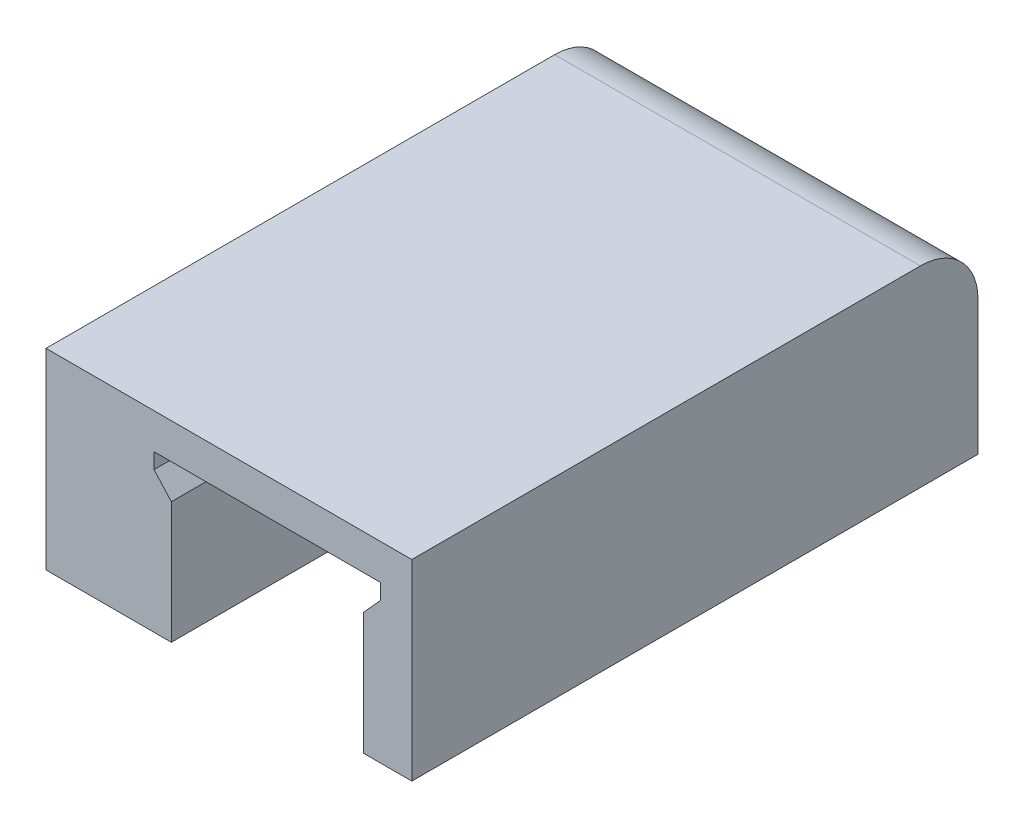
ISO-10303-21;
HEADER;
FILE_DESCRIPTION(('STEP AP214'),'2;1');
FILE_NAME('part.step','',(''),(''),'','','');
FILE_SCHEMA(('AUTOMOTIVE_DESIGN { 1 0 10303 214 1 1 1 1 }'));
ENDSEC;
DATA;
#1=APPLICATION_CONTEXT('core data for automotive mechanical design processes');
#2=APPLICATION_PROTOCOL_DEFINITION('international standard','automotive_design',2000,#1);
#3=PRODUCT_CONTEXT('',#1,'mechanical');
#4=PRODUCT('Part','Part','',(#3));
#5=PRODUCT_RELATED_PRODUCT_CATEGORY('part','',(#4));
#6=PRODUCT_DEFINITION_FORMATION('','',#4);
#7=PRODUCT_DEFINITION_CONTEXT('part definition',#1,'design');
#8=PRODUCT_DEFINITION('design','',#6,#7);
#9=PRODUCT_DEFINITION_SHAPE('','',#8);
#10=(LENGTH_UNIT() NAMED_UNIT(*) SI_UNIT(.MILLI.,.METRE.));
#11=(NAMED_UNIT(*) PLANE_ANGLE_UNIT() SI_UNIT($,.RADIAN.));
#12=(NAMED_UNIT(*) SI_UNIT($,.STERADIAN.) SOLID_ANGLE_UNIT());
#13=UNCERTAINTY_MEASURE_WITH_UNIT(LENGTH_MEASURE(1.E-05),#10,'distance_accuracy_value','');
#14=(GEOMETRIC_REPRESENTATION_CONTEXT(3) GLOBAL_UNCERTAINTY_ASSIGNED_CONTEXT((#13)) GLOBAL_UNIT_ASSIGNED_CONTEXT((#10,
#11,#12)) REPRESENTATION_CONTEXT('',''));
#15=CARTESIAN_POINT('',(0.,0.,0.));
#16=DIRECTION('',(0.,0.,1.));
#17=DIRECTION('',(1.,0.,0.));
#18=AXIS2_PLACEMENT_3D('',#15,#16,#17);
#19=CARTESIAN_POINT('',(13.06,5.,-14.75));
#20=DIRECTION('',(0.,0.,1.));
#21=DIRECTION('',(1.,0.,0.));
#22=AXIS2_PLACEMENT_3D('',#19,#20,#21);
#23=PLANE('',#22);
#24=DIRECTION('',(-1.,0.,0.));
#25=VECTOR('',#24,1.);
#26=CARTESIAN_POINT('',(13.06,-5.,-14.75));
#27=LINE('',#26,#25);
#28=CARTESIAN_POINT('',(14.06,-5.,-14.75));
#29=VERTEX_POINT('',#28);
#30=CARTESIAN_POINT('',(-5.,-5.,-14.75));
#31=VERTEX_POINT('',#30);
#32=EDGE_CURVE('E222',#29,#31,#27,.T.);
#33=ORIENTED_EDGE('',*,*,#32,.T.);
#34=DIRECTION('',(0.,1.,0.));
#35=VECTOR('',#34,1.);
#36=CARTESIAN_POINT('',(-5.,0.,-14.75));
#37=LINE('',#36,#35);
#38=CARTESIAN_POINT('',(-5.,2.,-14.75));
#39=VERTEX_POINT('',#38);
#40=EDGE_CURVE('E166',#31,#39,#37,.T.);
#41=ORIENTED_EDGE('',*,*,#40,.T.);
#42=DIRECTION('',(-1.,0.,0.));
#43=VECTOR('',#42,1.);
#44=CARTESIAN_POINT('',(13.06,2.,-14.75));
#45=LINE('',#44,#43);
#46=CARTESIAN_POINT('',(14.06,2.,-14.75));
#47=VERTEX_POINT('',#46);
#48=EDGE_CURVE('E238',#39,#47,#45,.F.);
#49=ORIENTED_EDGE('',*,*,#48,.T.);
#50=DIRECTION('',(0.,1.,0.));
#51=VECTOR('',#50,1.);
#52=CARTESIAN_POINT('',(14.06,-5.,-14.75));
#53=LINE('',#52,#51);
#54=EDGE_CURVE('E174',#29,#47,#53,.T.);
#55=ORIENTED_EDGE('',*,*,#54,.F.);
#56=EDGE_LOOP('',(#33,#41,#49,#55));
#57=FACE_BOUND('',#56,.T.);
#58=ADVANCED_FACE('F41',(#57),#23,.F.);
#59=CARTESIAN_POINT('',(13.06,5.,14.75));
#60=DIRECTION('',(0.,-1.,0.));
#61=DIRECTION('',(0.,0.,-1.));
#62=AXIS2_PLACEMENT_3D('',#59,#60,#61);
#63=PLANE('',#62);
#64=DIRECTION('',(-1.,0.,0.));
#65=VECTOR('',#64,1.);
#66=CARTESIAN_POINT('',(13.06,5.,14.75));
#67=LINE('',#66,#65);
#68=CARTESIAN_POINT('',(14.06,5.,14.75));
#69=VERTEX_POINT('',#68);
#70=CARTESIAN_POINT('',(-5.,5.,14.75));
#71=VERTEX_POINT('',#70);
#72=EDGE_CURVE('E136',#69,#71,#67,.T.);
#73=ORIENTED_EDGE('',*,*,#72,.F.);
#74=DIRECTION('',(0.,0.,1.));
#75=VECTOR('',#74,1.);
#76=CARTESIAN_POINT('',(14.06,5.,-11.75));
#77=LINE('',#76,#75);
#78=CARTESIAN_POINT('',(14.06,5.,-11.75));
#79=VERTEX_POINT('',#78);
#80=EDGE_CURVE('E180',#79,#69,#77,.T.);
#81=ORIENTED_EDGE('',*,*,#80,.F.);
#82=DIRECTION('',(-1.,0.,0.));
#83=VECTOR('',#82,1.);
#84=CARTESIAN_POINT('',(13.06,5.,-11.75));
#85=LINE('',#84,#83);
#86=CARTESIAN_POINT('',(-5.,5.,-11.75));
#87=VERTEX_POINT('',#86);
#88=EDGE_CURVE('E148',#79,#87,#85,.T.);
#89=ORIENTED_EDGE('',*,*,#88,.T.);
#90=DIRECTION('',(0.,0.,1.));
#91=VECTOR('',#90,1.);
#92=CARTESIAN_POINT('',(-5.,5.,0.));
#93=LINE('',#92,#91);
#94=EDGE_CURVE('E156',#87,#71,#93,.T.);
#95=ORIENTED_EDGE('',*,*,#94,.T.);
#96=EDGE_LOOP('',(#73,#81,#89,#95));
#97=FACE_BOUND('',#96,.T.);
#98=ADVANCED_FACE('F162',(#97),#63,.F.);
#99=CARTESIAN_POINT('',(13.06,5.,14.75));
#100=DIRECTION('',(0.,0.,-1.));
#101=DIRECTION('',(0.,1.,0.));
#102=AXIS2_PLACEMENT_3D('',#99,#100,#101);
#103=PLANE('',#102);
#104=DIRECTION('',(0.66896473162245,0.743294146247166,0.));
#105=VECTOR('',#104,1.);
#106=CARTESIAN_POINT('',(12.43,2.34243959921544,14.75));
#107=LINE('',#106,#105);
#108=CARTESIAN_POINT('',(11.53,1.34243959921544,14.75));
#109=VERTEX_POINT('',#108);
#110=CARTESIAN_POINT('',(12.43,2.34243959921544,14.75));
#111=VERTEX_POINT('',#110);
#112=EDGE_CURVE('E204',#109,#111,#107,.T.);
#113=ORIENTED_EDGE('',*,*,#112,.F.);
#114=DIRECTION('',(0.,1.,0.));
#115=VECTOR('',#114,1.);
#116=CARTESIAN_POINT('',(11.53,1.34243959921544,14.75));
#117=LINE('',#116,#115);
#118=CARTESIAN_POINT('',(11.53,-5.,14.75));
#119=VERTEX_POINT('',#118);
#120=EDGE_CURVE('E183',#119,#109,#117,.T.);
#121=ORIENTED_EDGE('',*,*,#120,.F.);
#122=DIRECTION('',(-1.,0.,0.));
#123=VECTOR('',#122,1.);
#124=CARTESIAN_POINT('',(13.06,-5.,14.75));
#125=LINE('',#124,#123);
#126=CARTESIAN_POINT('',(14.06,-5.,14.75));
#127=VERTEX_POINT('',#126);
#128=EDGE_CURVE('E149',#127,#119,#125,.T.);
#129=ORIENTED_EDGE('',*,*,#128,.F.);
#130=DIRECTION('',(0.,-1.,0.));
#131=VECTOR('',#130,1.);
#132=CARTESIAN_POINT('',(14.06,5.,14.75));
#133=LINE('',#132,#131);
#134=EDGE_CURVE('E143',#69,#127,#133,.T.);
#135=ORIENTED_EDGE('',*,*,#134,.F.);
#136=ORIENTED_EDGE('',*,*,#72,.T.);
#137=DIRECTION('',(0.,-1.,0.));
#138=VECTOR('',#137,1.);
#139=CARTESIAN_POINT('',(-5.,0.,14.75));
#140=LINE('',#139,#138);
#141=CARTESIAN_POINT('',(-5.,-5.,14.75));
#142=VERTEX_POINT('',#141);
#143=EDGE_CURVE('E141',#71,#142,#140,.T.);
#144=ORIENTED_EDGE('',*,*,#143,.T.);
#145=CARTESIAN_POINT('',(1.53,-5.,14.75));
#146=VERTEX_POINT('',#145);
#147=EDGE_CURVE('E234',#146,#142,#125,.T.);
#148=ORIENTED_EDGE('',*,*,#147,.F.);
#149=DIRECTION('',(0.,-1.,0.));
#150=VECTOR('',#149,1.);
#151=CARTESIAN_POINT('',(1.53,-7.00493567067932,14.75));
#152=LINE('',#151,#150);
#153=CARTESIAN_POINT('',(1.53,1.34243959921544,14.75));
#154=VERTEX_POINT('',#153);
#155=EDGE_CURVE('E187',#154,#146,#152,.T.);
#156=ORIENTED_EDGE('',*,*,#155,.F.);
#157=DIRECTION('',(0.66896473162245,-0.743294146247166,0.));
#158=VECTOR('',#157,1.);
#159=CARTESIAN_POINT('',(1.53,1.34243959921544,14.75));
#160=LINE('',#159,#158);
#161=CARTESIAN_POINT('',(0.63,2.34243959921544,14.75));
#162=VERTEX_POINT('',#161);
#163=EDGE_CURVE('E216',#162,#154,#160,.T.);
#164=ORIENTED_EDGE('',*,*,#163,.F.);
#165=DIRECTION('',(0.,-1.,0.));
#166=VECTOR('',#165,1.);
#167=CARTESIAN_POINT('',(0.63,2.34243959921544,14.75));
#168=LINE('',#167,#166);
#169=CARTESIAN_POINT('',(0.63,3.15,14.75));
#170=VERTEX_POINT('',#169);
#171=EDGE_CURVE('E213',#170,#162,#168,.T.);
#172=ORIENTED_EDGE('',*,*,#171,.F.);
#173=DIRECTION('',(-1.,0.,0.));
#174=VECTOR('',#173,1.);
#175=CARTESIAN_POINT('',(0.63,3.15,14.75));
#176=LINE('',#175,#174);
#177=CARTESIAN_POINT('',(12.43,3.15,14.75));
#178=VERTEX_POINT('',#177);
#179=EDGE_CURVE('E210',#178,#170,#176,.T.);
#180=ORIENTED_EDGE('',*,*,#179,.F.);
#181=DIRECTION('',(0.,1.,0.));
#182=VECTOR('',#181,1.);
#183=CARTESIAN_POINT('',(12.43,3.15,14.75));
#184=LINE('',#183,#182);
#185=EDGE_CURVE('E207',#111,#178,#184,.T.);
#186=ORIENTED_EDGE('',*,*,#185,.F.);
#187=EDGE_LOOP('',(#113,#121,#129,#135,#136,#144,#148,#156,#164,#172,#180,#186));
#188=FACE_BOUND('',#187,.T.);
#189=ADVANCED_FACE('F139',(#188),#103,.F.);
#190=CARTESIAN_POINT('',(13.06,-5.,14.75));
#191=DIRECTION('',(0.,1.,0.));
#192=DIRECTION('',(0.,0.,1.));
#193=AXIS2_PLACEMENT_3D('',#190,#191,#192);
#194=PLANE('',#193);
#195=ORIENTED_EDGE('',*,*,#128,.T.);
#196=DIRECTION('',(0.,0.,-1.));
#197=VECTOR('',#196,1.);
#198=CARTESIAN_POINT('',(11.53,-5.,14.75));
#199=LINE('',#198,#197);
#200=CARTESIAN_POINT('',(11.53,-5.,-10.6));
#201=VERTEX_POINT('',#200);
#202=EDGE_CURVE('E11',#119,#201,#199,.T.);
#203=ORIENTED_EDGE('',*,*,#202,.T.);
#204=DIRECTION('',(-1.,0.,0.));
#205=VECTOR('',#204,1.);
#206=CARTESIAN_POINT('',(13.06,-5.,-10.6));
#207=LINE('',#206,#205);
#208=CARTESIAN_POINT('',(1.53,-5.,-10.6));
#209=VERTEX_POINT('',#208);
#210=EDGE_CURVE('E61',#201,#209,#207,.T.);
#211=ORIENTED_EDGE('',*,*,#210,.T.);
#212=DIRECTION('',(0.,0.,1.));
#213=VECTOR('',#212,1.);
#214=CARTESIAN_POINT('',(1.53,-5.,14.75));
#215=LINE('',#214,#213);
#216=EDGE_CURVE('E49',#209,#146,#215,.T.);
#217=ORIENTED_EDGE('',*,*,#216,.T.);
#218=ORIENTED_EDGE('',*,*,#147,.T.);
#219=DIRECTION('',(0.,0.,-1.));
#220=VECTOR('',#219,1.);
#221=CARTESIAN_POINT('',(-5.,-5.,0.));
#222=LINE('',#221,#220);
#223=EDGE_CURVE('E160',#142,#31,#222,.T.);
#224=ORIENTED_EDGE('',*,*,#223,.T.);
#225=ORIENTED_EDGE('',*,*,#32,.F.);
#226=DIRECTION('',(0.,0.,-1.));
#227=VECTOR('',#226,1.);
#228=CARTESIAN_POINT('',(14.06,-5.,14.75));
#229=LINE('',#228,#227);
#230=EDGE_CURVE('E171',#127,#29,#229,.T.);
#231=ORIENTED_EDGE('',*,*,#230,.F.);
#232=EDGE_LOOP('',(#195,#203,#211,#217,#218,#224,#225,#231));
#233=FACE_BOUND('',#232,.T.);
#234=ADVANCED_FACE('F242',(#233),#194,.F.);
#235=CARTESIAN_POINT('',(13.06,2.,-11.75));
#236=DIRECTION('',(-1.,0.,0.));
#237=DIRECTION('',(0.,0.,1.));
#238=AXIS2_PLACEMENT_3D('',#235,#236,#237);
#239=CYLINDRICAL_SURFACE('',#238,3.);
#240=ORIENTED_EDGE('',*,*,#88,.F.);
#241=CARTESIAN_POINT('',(14.06,2.,-11.75));
#242=DIRECTION('',(1.,0.,0.));
#243=DIRECTION('',(0.,0.,-1.));
#244=AXIS2_PLACEMENT_3D('',#241,#242,#243);
#245=CIRCLE('',#244,3.);
#246=EDGE_CURVE('E177',#47,#79,#245,.T.);
#247=ORIENTED_EDGE('',*,*,#246,.F.);
#248=ORIENTED_EDGE('',*,*,#48,.F.);
#249=CARTESIAN_POINT('',(-5.,2.,-11.75));
#250=DIRECTION('',(1.,0.,0.));
#251=DIRECTION('',(0.,0.,-1.));
#252=AXIS2_PLACEMENT_3D('',#249,#250,#251);
#253=CIRCLE('',#252,3.);
#254=EDGE_CURVE('E169',#39,#87,#253,.T.);
#255=ORIENTED_EDGE('',*,*,#254,.T.);
#256=EDGE_LOOP('',(#240,#247,#248,#255));
#257=FACE_BOUND('',#256,.T.);
#258=ADVANCED_FACE('F43',(#257),#239,.T.);
#259=CARTESIAN_POINT('',(11.53,1.34243959921544,-10.6));
#260=DIRECTION('',(1.,0.,0.));
#261=DIRECTION('',(0.,1.,0.));
#262=AXIS2_PLACEMENT_3D('',#259,#260,#261);
#263=PLANE('',#262);
#264=ORIENTED_EDGE('',*,*,#120,.T.);
#265=DIRECTION('',(0.,0.,1.));
#266=VECTOR('',#265,1.);
#267=CARTESIAN_POINT('',(11.53,1.34243959921544,-10.6));
#268=LINE('',#267,#266);
#269=CARTESIAN_POINT('',(11.53,1.34243959921544,-10.6));
#270=VERTEX_POINT('',#269);
#271=EDGE_CURVE('E202',#270,#109,#268,.T.);
#272=ORIENTED_EDGE('',*,*,#271,.F.);
#273=DIRECTION('',(0.,1.,0.));
#274=VECTOR('',#273,1.);
#275=CARTESIAN_POINT('',(11.53,1.34243959921544,-10.6));
#276=LINE('',#275,#274);
#277=EDGE_CURVE('E184',#201,#270,#276,.T.);
#278=ORIENTED_EDGE('',*,*,#277,.F.);
#279=ORIENTED_EDGE('',*,*,#202,.F.);
#280=EDGE_LOOP('',(#264,#272,#278,#279));
#281=FACE_BOUND('',#280,.T.);
#282=ADVANCED_FACE('F286',(#281),#263,.F.);
#283=CARTESIAN_POINT('',(1.53,-7.00493567067932,-10.6));
#284=DIRECTION('',(-1.,0.,0.));
#285=DIRECTION('',(0.,0.,1.));
#286=AXIS2_PLACEMENT_3D('',#283,#284,#285);
#287=PLANE('',#286);
#288=DIRECTION('',(0.,-1.,0.));
#289=VECTOR('',#288,1.);
#290=CARTESIAN_POINT('',(1.53,-7.00493567067932,-10.6));
#291=LINE('',#290,#289);
#292=CARTESIAN_POINT('',(1.53,1.34243959921544,-10.6));
#293=VERTEX_POINT('',#292);
#294=EDGE_CURVE('E56',#293,#209,#291,.T.);
#295=ORIENTED_EDGE('',*,*,#294,.F.);
#296=DIRECTION('',(0.,0.,1.));
#297=VECTOR('',#296,1.);
#298=CARTESIAN_POINT('',(1.53,1.34243959921544,-10.6));
#299=LINE('',#298,#297);
#300=EDGE_CURVE('E220',#293,#154,#299,.T.);
#301=ORIENTED_EDGE('',*,*,#300,.T.);
#302=ORIENTED_EDGE('',*,*,#155,.T.);
#303=ORIENTED_EDGE('',*,*,#216,.F.);
#304=EDGE_LOOP('',(#295,#301,#302,#303));
#305=FACE_BOUND('',#304,.T.);
#306=ADVANCED_FACE('F247',(#305),#287,.F.);
#307=CARTESIAN_POINT('',(0.,0.,-10.6));
#308=DIRECTION('',(0.,0.,-1.));
#309=DIRECTION('',(-1.,0.,0.));
#310=AXIS2_PLACEMENT_3D('',#307,#308,#309);
#311=PLANE('',#310);
#312=ORIENTED_EDGE('',*,*,#277,.T.);
#313=DIRECTION('',(0.66896473162245,0.743294146247166,0.));
#314=VECTOR('',#313,1.);
#315=CARTESIAN_POINT('',(12.43,2.34243959921544,-10.6));
#316=LINE('',#315,#314);
#317=CARTESIAN_POINT('',(12.43,2.34243959921544,-10.6));
#318=VERTEX_POINT('',#317);
#319=EDGE_CURVE('E186',#270,#318,#316,.T.);
#320=ORIENTED_EDGE('',*,*,#319,.T.);
#321=DIRECTION('',(0.,1.,0.));
#322=VECTOR('',#321,1.);
#323=CARTESIAN_POINT('',(12.43,3.15,-10.6));
#324=LINE('',#323,#322);
#325=CARTESIAN_POINT('',(12.43,3.15,-10.6));
#326=VERTEX_POINT('',#325);
#327=EDGE_CURVE('E190',#318,#326,#324,.T.);
#328=ORIENTED_EDGE('',*,*,#327,.T.);
#329=DIRECTION('',(-1.,0.,0.));
#330=VECTOR('',#329,1.);
#331=CARTESIAN_POINT('',(0.63,3.15,-10.6));
#332=LINE('',#331,#330);
#333=CARTESIAN_POINT('',(0.63,3.15,-10.6));
#334=VERTEX_POINT('',#333);
#335=EDGE_CURVE('E193',#326,#334,#332,.T.);
#336=ORIENTED_EDGE('',*,*,#335,.T.);
#337=DIRECTION('',(0.,-1.,0.));
#338=VECTOR('',#337,1.);
#339=CARTESIAN_POINT('',(0.63,2.34243959921544,-10.6));
#340=LINE('',#339,#338);
#341=CARTESIAN_POINT('',(0.63,2.34243959921544,-10.6));
#342=VERTEX_POINT('',#341);
#343=EDGE_CURVE('E196',#334,#342,#340,.T.);
#344=ORIENTED_EDGE('',*,*,#343,.T.);
#345=DIRECTION('',(0.66896473162245,-0.743294146247166,0.));
#346=VECTOR('',#345,1.);
#347=CARTESIAN_POINT('',(1.53,1.34243959921544,-10.6));
#348=LINE('',#347,#346);
#349=EDGE_CURVE('E199',#342,#293,#348,.T.);
#350=ORIENTED_EDGE('',*,*,#349,.T.);
#351=ORIENTED_EDGE('',*,*,#294,.T.);
#352=ORIENTED_EDGE('',*,*,#210,.F.);
#353=EDGE_LOOP('',(#312,#320,#328,#336,#344,#350,#351,#352));
#354=FACE_BOUND('',#353,.T.);
#355=ADVANCED_FACE('F299',(#354),#311,.F.);
#356=CARTESIAN_POINT('',(1.53,1.34243959921544,-10.6));
#357=DIRECTION('',(-0.743294146247166,-0.66896473162245,0.));
#358=DIRECTION('',(0.66896473162245,-0.743294146247166,0.));
#359=AXIS2_PLACEMENT_3D('',#356,#357,#358);
#360=PLANE('',#359);
#361=ORIENTED_EDGE('',*,*,#163,.T.);
#362=ORIENTED_EDGE('',*,*,#300,.F.);
#363=ORIENTED_EDGE('',*,*,#349,.F.);
#364=DIRECTION('',(0.,0.,1.));
#365=VECTOR('',#364,1.);
#366=CARTESIAN_POINT('',(0.63,2.34243959921544,-10.6));
#367=LINE('',#366,#365);
#368=EDGE_CURVE('E223',#342,#162,#367,.T.);
#369=ORIENTED_EDGE('',*,*,#368,.T.);
#370=EDGE_LOOP('',(#361,#362,#363,#369));
#371=FACE_BOUND('',#370,.T.);
#372=ADVANCED_FACE('F250',(#371),#360,.F.);
#373=CARTESIAN_POINT('',(0.63,2.34243959921544,-10.6));
#374=DIRECTION('',(-1.,0.,0.));
#375=DIRECTION('',(0.,0.,1.));
#376=AXIS2_PLACEMENT_3D('',#373,#374,#375);
#377=PLANE('',#376);
#378=ORIENTED_EDGE('',*,*,#171,.T.);
#379=ORIENTED_EDGE('',*,*,#368,.F.);
#380=ORIENTED_EDGE('',*,*,#343,.F.);
#381=DIRECTION('',(0.,0.,1.));
#382=VECTOR('',#381,1.);
#383=CARTESIAN_POINT('',(0.63,3.15,-10.6));
#384=LINE('',#383,#382);
#385=EDGE_CURVE('E225',#334,#170,#384,.T.);
#386=ORIENTED_EDGE('',*,*,#385,.T.);
#387=EDGE_LOOP('',(#378,#379,#380,#386));
#388=FACE_BOUND('',#387,.T.);
#389=ADVANCED_FACE('F253',(#388),#377,.F.);
#390=CARTESIAN_POINT('',(0.63,3.15,-10.6));
#391=DIRECTION('',(0.,1.,0.));
#392=DIRECTION('',(0.,0.,1.));
#393=AXIS2_PLACEMENT_3D('',#390,#391,#392);
#394=PLANE('',#393);
#395=ORIENTED_EDGE('',*,*,#179,.T.);
#396=ORIENTED_EDGE('',*,*,#385,.F.);
#397=ORIENTED_EDGE('',*,*,#335,.F.);
#398=DIRECTION('',(0.,0.,1.));
#399=VECTOR('',#398,1.);
#400=CARTESIAN_POINT('',(12.43,3.15,-10.6));
#401=LINE('',#400,#399);
#402=EDGE_CURVE('E227',#326,#178,#401,.T.);
#403=ORIENTED_EDGE('',*,*,#402,.T.);
#404=EDGE_LOOP('',(#395,#396,#397,#403));
#405=FACE_BOUND('',#404,.T.);
#406=ADVANCED_FACE('F257',(#405),#394,.F.);
#407=CARTESIAN_POINT('',(12.43,3.15,-10.6));
#408=DIRECTION('',(1.,0.,0.));
#409=DIRECTION('',(0.,0.,-1.));
#410=AXIS2_PLACEMENT_3D('',#407,#408,#409);
#411=PLANE('',#410);
#412=ORIENTED_EDGE('',*,*,#185,.T.);
#413=ORIENTED_EDGE('',*,*,#402,.F.);
#414=ORIENTED_EDGE('',*,*,#327,.F.);
#415=DIRECTION('',(0.,0.,1.));
#416=VECTOR('',#415,1.);
#417=CARTESIAN_POINT('',(12.43,2.34243959921544,-10.6));
#418=LINE('',#417,#416);
#419=EDGE_CURVE('E229',#318,#111,#418,.T.);
#420=ORIENTED_EDGE('',*,*,#419,.T.);
#421=EDGE_LOOP('',(#412,#413,#414,#420));
#422=FACE_BOUND('',#421,.T.);
#423=ADVANCED_FACE('F261',(#422),#411,.F.);
#424=CARTESIAN_POINT('',(12.43,2.34243959921544,-10.6));
#425=DIRECTION('',(0.743294146247166,-0.668964731622449,0.));
#426=DIRECTION('',(0.66896473162245,0.743294146247166,0.));
#427=AXIS2_PLACEMENT_3D('',#424,#425,#426);
#428=PLANE('',#427);
#429=ORIENTED_EDGE('',*,*,#112,.T.);
#430=ORIENTED_EDGE('',*,*,#419,.F.);
#431=ORIENTED_EDGE('',*,*,#319,.F.);
#432=ORIENTED_EDGE('',*,*,#271,.T.);
#433=EDGE_LOOP('',(#429,#430,#431,#432));
#434=FACE_BOUND('',#433,.T.);
#435=ADVANCED_FACE('F264',(#434),#428,.F.);
#436=CARTESIAN_POINT('',(14.06,2.,-11.75));
#437=DIRECTION('',(1.,0.,0.));
#438=DIRECTION('',(0.,0.,-1.));
#439=AXIS2_PLACEMENT_3D('',#436,#437,#438);
#440=PLANE('',#439);
#441=ORIENTED_EDGE('',*,*,#230,.T.);
#442=ORIENTED_EDGE('',*,*,#54,.T.);
#443=ORIENTED_EDGE('',*,*,#246,.T.);
#444=ORIENTED_EDGE('',*,*,#80,.T.);
#445=ORIENTED_EDGE('',*,*,#134,.T.);
#446=EDGE_LOOP('',(#441,#442,#443,#444,#445));
#447=FACE_BOUND('',#446,.T.);
#448=ADVANCED_FACE('F271',(#447),#440,.T.);
#449=CARTESIAN_POINT('',(-5.,2.,-11.75));
#450=DIRECTION('',(1.,0.,0.));
#451=DIRECTION('',(0.,0.,-1.));
#452=AXIS2_PLACEMENT_3D('',#449,#450,#451);
#453=PLANE('',#452);
#454=ORIENTED_EDGE('',*,*,#94,.F.);
#455=ORIENTED_EDGE('',*,*,#254,.F.);
#456=ORIENTED_EDGE('',*,*,#40,.F.);
#457=ORIENTED_EDGE('',*,*,#223,.F.);
#458=ORIENTED_EDGE('',*,*,#143,.F.);
#459=EDGE_LOOP('',(#454,#455,#456,#457,#458));
#460=FACE_BOUND('',#459,.T.);
#461=ADVANCED_FACE('F154',(#460),#453,.F.);
#462=CLOSED_SHELL('',(#58,#98,#189,#234,#258,#282,#306,#355,#372,#389,#406,#423,#435,#448,#461));
#463=MANIFOLD_SOLID_BREP('B2',#462);
#464=ADVANCED_BREP_SHAPE_REPRESENTATION('',(#18,#463),#14);
#465=SHAPE_DEFINITION_REPRESENTATION(#9,#464);
ENDSEC;
END-ISO-10303-21;
